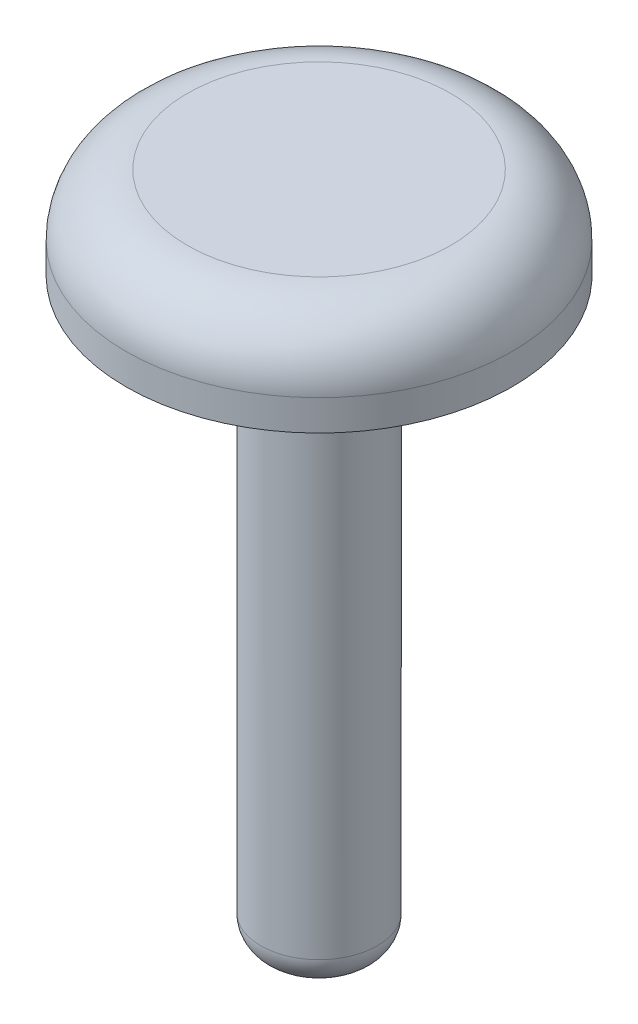
ISO-10303-21;
HEADER;
FILE_DESCRIPTION(('STEP AP214'),'2;1');
FILE_NAME('part.step','',(''),(''),'','','');
FILE_SCHEMA(('AUTOMOTIVE_DESIGN { 1 0 10303 214 1 1 1 1 }'));
ENDSEC;
DATA;
#1=APPLICATION_CONTEXT('core data for automotive mechanical design processes');
#2=APPLICATION_PROTOCOL_DEFINITION('international standard','automotive_design',2000,#1);
#3=PRODUCT_CONTEXT('',#1,'mechanical');
#4=PRODUCT('Part','Part','',(#3));
#5=PRODUCT_RELATED_PRODUCT_CATEGORY('part','',(#4));
#6=PRODUCT_DEFINITION_FORMATION('','',#4);
#7=PRODUCT_DEFINITION_CONTEXT('part definition',#1,'design');
#8=PRODUCT_DEFINITION('design','',#6,#7);
#9=PRODUCT_DEFINITION_SHAPE('','',#8);
#10=(LENGTH_UNIT() NAMED_UNIT(*) SI_UNIT(.MILLI.,.METRE.));
#11=(NAMED_UNIT(*) PLANE_ANGLE_UNIT() SI_UNIT($,.RADIAN.));
#12=(NAMED_UNIT(*) SI_UNIT($,.STERADIAN.) SOLID_ANGLE_UNIT());
#13=UNCERTAINTY_MEASURE_WITH_UNIT(LENGTH_MEASURE(1.E-05),#10,'distance_accuracy_value','');
#14=(GEOMETRIC_REPRESENTATION_CONTEXT(3) GLOBAL_UNCERTAINTY_ASSIGNED_CONTEXT((#13)) GLOBAL_UNIT_ASSIGNED_CONTEXT((#10,
#11,#12)) REPRESENTATION_CONTEXT('',''));
#15=CARTESIAN_POINT('',(0.,0.,0.));
#16=DIRECTION('',(0.,0.,1.));
#17=DIRECTION('',(1.,0.,0.));
#18=AXIS2_PLACEMENT_3D('',#15,#16,#17);
#19=CARTESIAN_POINT('',(0.,9.5,0.));
#20=DIRECTION('',(0.,1.,0.));
#21=DIRECTION('',(0.,0.,1.));
#22=AXIS2_PLACEMENT_3D('',#19,#20,#21);
#23=PLANE('',#22);
#24=CARTESIAN_POINT('',(0.,9.5,0.));
#25=DIRECTION('',(0.,-1.,0.));
#26=DIRECTION('',(0.,0.,-1.));
#27=AXIS2_PLACEMENT_3D('',#24,#25,#26);
#28=CIRCLE('',#27,2.65);
#29=CARTESIAN_POINT('',(0.,9.5,-2.65));
#30=VERTEX_POINT('',#29);
#31=EDGE_CURVE('E57',#30,#30,#28,.T.);
#32=ORIENTED_EDGE('',*,*,#31,.F.);
#33=EDGE_LOOP('',(#32));
#34=FACE_BOUND('',#33,.T.);
#35=CARTESIAN_POINT('',(0.,9.5,0.));
#36=DIRECTION('',(0.,1.,0.));
#37=DIRECTION('',(0.,0.,1.));
#38=AXIS2_PLACEMENT_3D('',#35,#36,#37);
#39=CIRCLE('',#38,3.15);
#40=CARTESIAN_POINT('',(0.,9.5,3.15));
#41=VERTEX_POINT('',#40);
#42=EDGE_CURVE('E53',#41,#41,#39,.T.);
#43=ORIENTED_EDGE('',*,*,#42,.F.);
#44=EDGE_LOOP('',(#43));
#45=FACE_BOUND('',#44,.T.);
#46=ADVANCED_FACE('F33',(#34,#45),#23,.F.);
#47=CARTESIAN_POINT('',(0.,9.5,0.));
#48=DIRECTION('',(0.,1.,0.));
#49=DIRECTION('',(0.,0.,1.));
#50=AXIS2_PLACEMENT_3D('',#47,#48,#49);
#51=CYLINDRICAL_SURFACE('',#50,3.15);
#52=CARTESIAN_POINT('',(0.,10.0001,0.));
#53=DIRECTION('',(0.,1.,0.));
#54=DIRECTION('',(0.,0.,1.));
#55=AXIS2_PLACEMENT_3D('',#52,#53,#54);
#56=CIRCLE('',#55,3.15);
#57=CARTESIAN_POINT('',(0.,10.0001,3.15));
#58=VERTEX_POINT('',#57);
#59=EDGE_CURVE('E10',#58,#58,#56,.F.);
#60=ORIENTED_EDGE('',*,*,#59,.T.);
#61=EDGE_LOOP('',(#60));
#62=FACE_BOUND('',#61,.T.);
#63=ORIENTED_EDGE('',*,*,#42,.T.);
#64=EDGE_LOOP('',(#63));
#65=FACE_BOUND('',#64,.T.);
#66=ADVANCED_FACE('F81',(#62,#65),#51,.T.);
#67=CARTESIAN_POINT('',(0.,11.0001,0.));
#68=DIRECTION('',(0.,1.,0.));
#69=DIRECTION('',(0.,0.,1.));
#70=AXIS2_PLACEMENT_3D('',#67,#68,#69);
#71=PLANE('',#70);
#72=CARTESIAN_POINT('',(0.,11.0001,0.));
#73=DIRECTION('',(0.,1.,0.));
#74=DIRECTION('',(0.,0.,1.));
#75=AXIS2_PLACEMENT_3D('',#72,#73,#74);
#76=CIRCLE('',#75,2.15);
#77=CARTESIAN_POINT('',(0.,11.0001,2.15));
#78=VERTEX_POINT('',#77);
#79=EDGE_CURVE('E40',#78,#78,#76,.T.);
#80=ORIENTED_EDGE('',*,*,#79,.T.);
#81=EDGE_LOOP('',(#80));
#82=FACE_BOUND('',#81,.T.);
#83=ADVANCED_FACE('F87',(#82),#71,.T.);
#84=CARTESIAN_POINT('',(0.,10.0001,0.));
#85=DIRECTION('',(0.,1.,0.));
#86=DIRECTION('',(0.,0.,1.));
#87=AXIS2_PLACEMENT_3D('',#84,#85,#86);
#88=TOROIDAL_SURFACE('',#87,2.15,1.);
#89=ORIENTED_EDGE('',*,*,#59,.F.);
#90=EDGE_LOOP('',(#89));
#91=FACE_BOUND('',#90,.T.);
#92=ORIENTED_EDGE('',*,*,#79,.F.);
#93=EDGE_LOOP('',(#92));
#94=FACE_BOUND('',#93,.T.);
#95=ADVANCED_FACE('F35',(#91,#94),#88,.T.);
#96=CARTESIAN_POINT('',(0.,10.5,0.));
#97=DIRECTION('',(0.,-1.,0.));
#98=DIRECTION('',(0.,0.,-1.));
#99=AXIS2_PLACEMENT_3D('',#96,#97,#98);
#100=CYLINDRICAL_SURFACE('',#99,2.65);
#101=CARTESIAN_POINT('',(0.,10.5,0.));
#102=DIRECTION('',(0.,-1.,0.));
#103=DIRECTION('',(0.,0.,-1.));
#104=AXIS2_PLACEMENT_3D('',#101,#102,#103);
#105=CIRCLE('',#104,2.65);
#106=CARTESIAN_POINT('',(0.,10.5,-2.65));
#107=VERTEX_POINT('',#106);
#108=EDGE_CURVE('E56',#107,#107,#105,.T.);
#109=ORIENTED_EDGE('',*,*,#108,.F.);
#110=EDGE_LOOP('',(#109));
#111=FACE_BOUND('',#110,.T.);
#112=ORIENTED_EDGE('',*,*,#31,.T.);
#113=EDGE_LOOP('',(#112));
#114=FACE_BOUND('',#113,.T.);
#115=ADVANCED_FACE('F98',(#111,#114),#100,.F.);
#116=CARTESIAN_POINT('',(0.,10.5,0.));
#117=DIRECTION('',(0.,-1.,0.));
#118=DIRECTION('',(0.,0.,-1.));
#119=AXIS2_PLACEMENT_3D('',#116,#117,#118);
#120=PLANE('',#119);
#121=CARTESIAN_POINT('',(0.,10.5,0.));
#122=DIRECTION('',(0.,-1.,0.));
#123=DIRECTION('',(0.,0.,-1.));
#124=AXIS2_PLACEMENT_3D('',#121,#122,#123);
#125=CIRCLE('',#124,0.95);
#126=CARTESIAN_POINT('',(0.,10.5,-0.95));
#127=VERTEX_POINT('',#126);
#128=EDGE_CURVE('E60',#127,#127,#125,.F.);
#129=ORIENTED_EDGE('',*,*,#128,.T.);
#130=EDGE_LOOP('',(#129));
#131=FACE_BOUND('',#130,.T.);
#132=ORIENTED_EDGE('',*,*,#108,.T.);
#133=EDGE_LOOP('',(#132));
#134=FACE_BOUND('',#133,.T.);
#135=ADVANCED_FACE('F66',(#131,#134),#120,.T.);
#136=CARTESIAN_POINT('',(0.,0.,0.));
#137=DIRECTION('',(0.,1.,0.));
#138=DIRECTION('',(0.,0.,1.));
#139=AXIS2_PLACEMENT_3D('',#136,#137,#138);
#140=PLANE('',#139);
#141=CARTESIAN_POINT('',(0.,0.,0.));
#142=DIRECTION('',(0.,1.,0.));
#143=DIRECTION('',(0.,0.,1.));
#144=AXIS2_PLACEMENT_3D('',#141,#142,#143);
#145=CIRCLE('',#144,0.449999999999999);
#146=CARTESIAN_POINT('',(0.,0.,0.449999999999999));
#147=VERTEX_POINT('',#146);
#148=EDGE_CURVE('E44',#147,#147,#145,.F.);
#149=ORIENTED_EDGE('',*,*,#148,.T.);
#150=EDGE_LOOP('',(#149));
#151=FACE_BOUND('',#150,.T.);
#152=ADVANCED_FACE('F77',(#151),#140,.F.);
#153=CARTESIAN_POINT('',(0.,0.5,0.));
#154=DIRECTION('',(0.,1.,0.));
#155=DIRECTION('',(0.,0.,1.));
#156=AXIS2_PLACEMENT_3D('',#153,#154,#155);
#157=DEGENERATE_TOROIDAL_SURFACE('',#156,0.449999999999999,0.5,.T.);
#158=ORIENTED_EDGE('',*,*,#148,.F.);
#159=EDGE_LOOP('',(#158));
#160=FACE_BOUND('',#159,.T.);
#161=CARTESIAN_POINT('',(0.,0.5,0.));
#162=DIRECTION('',(0.,1.,0.));
#163=DIRECTION('',(0.,0.,1.));
#164=AXIS2_PLACEMENT_3D('',#161,#162,#163);
#165=CIRCLE('',#164,0.95);
#166=CARTESIAN_POINT('',(0.,0.5,0.95));
#167=VERTEX_POINT('',#166);
#168=EDGE_CURVE('E48',#167,#167,#165,.T.);
#169=ORIENTED_EDGE('',*,*,#168,.F.);
#170=EDGE_LOOP('',(#169));
#171=FACE_BOUND('',#170,.T.);
#172=ADVANCED_FACE('F71',(#160,#171),#157,.T.);
#173=CARTESIAN_POINT('',(0.,11.,0.));
#174=DIRECTION('',(0.,-1.,0.));
#175=DIRECTION('',(0.,0.,-1.));
#176=AXIS2_PLACEMENT_3D('',#173,#174,#175);
#177=CYLINDRICAL_SURFACE('',#176,0.95);
#178=ORIENTED_EDGE('',*,*,#168,.T.);
#179=EDGE_LOOP('',(#178));
#180=FACE_BOUND('',#179,.T.);
#181=ORIENTED_EDGE('',*,*,#128,.F.);
#182=EDGE_LOOP('',(#181));
#183=FACE_BOUND('',#182,.T.);
#184=ADVANCED_FACE('F69',(#180,#183),#177,.T.);
#185=CLOSED_SHELL('',(#46,#66,#83,#95,#115,#135,#152,#172,#184));
#186=MANIFOLD_SOLID_BREP('B2',#185);
#187=ADVANCED_BREP_SHAPE_REPRESENTATION('',(#18,#186),#14);
#188=SHAPE_DEFINITION_REPRESENTATION(#9,#187);
ENDSEC;
END-ISO-10303-21;
